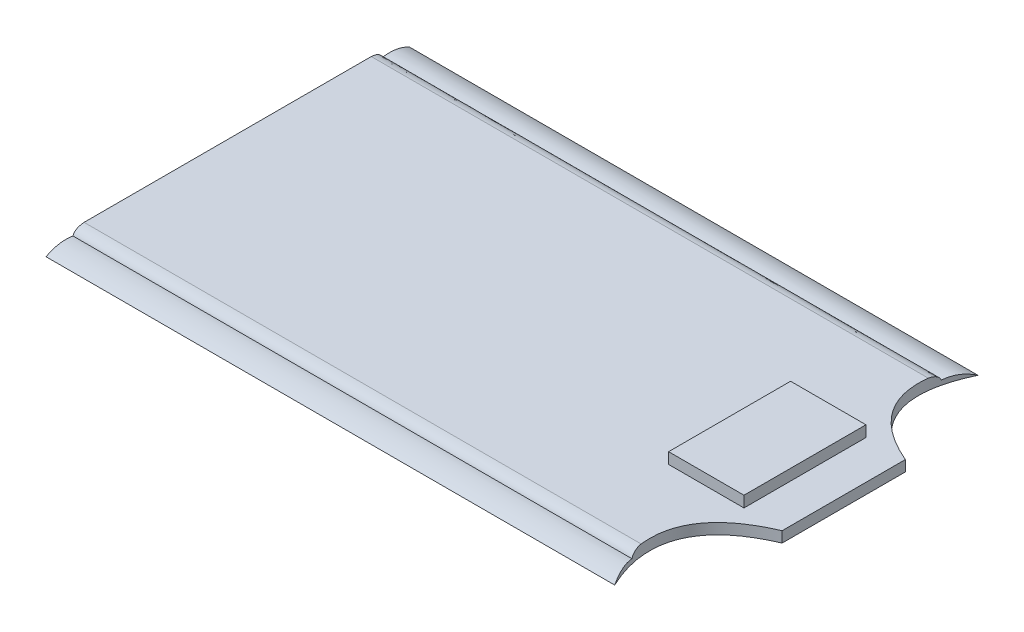
ISO-10303-21;
HEADER;
FILE_DESCRIPTION(('STEP AP214'),'2;1');
FILE_NAME('part.step','',(''),(''),'','','');
FILE_SCHEMA(('AUTOMOTIVE_DESIGN { 1 0 10303 214 1 1 1 1 }'));
ENDSEC;
DATA;
#1=APPLICATION_CONTEXT('core data for automotive mechanical design processes');
#2=APPLICATION_PROTOCOL_DEFINITION('international standard','automotive_design',2000,#1);
#3=PRODUCT_CONTEXT('',#1,'mechanical');
#4=PRODUCT('Part','Part','',(#3));
#5=PRODUCT_RELATED_PRODUCT_CATEGORY('part','',(#4));
#6=PRODUCT_DEFINITION_FORMATION('','',#4);
#7=PRODUCT_DEFINITION_CONTEXT('part definition',#1,'design');
#8=PRODUCT_DEFINITION('design','',#6,#7);
#9=PRODUCT_DEFINITION_SHAPE('','',#8);
#10=(LENGTH_UNIT() NAMED_UNIT(*) SI_UNIT(.MILLI.,.METRE.));
#11=(NAMED_UNIT(*) PLANE_ANGLE_UNIT() SI_UNIT($,.RADIAN.));
#12=(NAMED_UNIT(*) SI_UNIT($,.STERADIAN.) SOLID_ANGLE_UNIT());
#13=UNCERTAINTY_MEASURE_WITH_UNIT(LENGTH_MEASURE(1.E-05),#10,'distance_accuracy_value','');
#14=(GEOMETRIC_REPRESENTATION_CONTEXT(3) GLOBAL_UNCERTAINTY_ASSIGNED_CONTEXT((#13)) GLOBAL_UNIT_ASSIGNED_CONTEXT((#10,
#11,#12)) REPRESENTATION_CONTEXT('',''));
#15=CARTESIAN_POINT('',(0.,0.,0.));
#16=DIRECTION('',(0.,0.,1.));
#17=DIRECTION('',(1.,0.,0.));
#18=AXIS2_PLACEMENT_3D('',#15,#16,#17);
#19=CARTESIAN_POINT('',(1950.,17.0000000000001,-575.));
#20=DIRECTION('',(0.,-1.,0.));
#21=DIRECTION('',(0.,0.,-1.));
#22=AXIS2_PLACEMENT_3D('',#19,#20,#21);
#23=PLANE('',#22);
#24=DIRECTION('',(0.,0.,1.));
#25=VECTOR('',#24,1.);
#26=CARTESIAN_POINT('',(1950.,17.0000000000001,-575.));
#27=LINE('',#26,#25);
#28=CARTESIAN_POINT('',(1950.,16.9999999999999,-195.));
#29=VERTEX_POINT('',#28);
#30=CARTESIAN_POINT('',(1950.,16.9999999999999,195.));
#31=VERTEX_POINT('',#30);
#32=EDGE_CURVE('E229',#29,#31,#27,.T.);
#33=ORIENTED_EDGE('',*,*,#32,.F.);
#34=CARTESIAN_POINT('',(1950.,17.0000000000001,-195.));
#35=CARTESIAN_POINT('',(1676.16258696327,17.0000000000001,-312.417807061273));
#36=CARTESIAN_POINT('',(1800.,17.0000000000001,-575.));
#37=B_SPLINE_CURVE_WITH_KNOTS('',2,(#34,#35,#36),.UNSPECIFIED.,.F.,.F.,(3,3),(0.,1.),.UNSPECIFIED.);
#38=CARTESIAN_POINT('',(1763.12767606392,17.0000000000002,-454.506922220975));
#39=VERTEX_POINT('',#38);
#40=EDGE_CURVE('E187',#29,#39,#37,.T.);
#41=ORIENTED_EDGE('',*,*,#40,.T.);
#42=DIRECTION('',(1.,0.,0.));
#43=VECTOR('',#42,1.);
#44=CARTESIAN_POINT('',(0.,17.,-454.506922220975));
#45=LINE('',#44,#43);
#46=CARTESIAN_POINT('',(0.,17.,-454.506922220975));
#47=VERTEX_POINT('',#46);
#48=EDGE_CURVE('E211',#47,#39,#45,.T.);
#49=ORIENTED_EDGE('',*,*,#48,.F.);
#50=DIRECTION('',(0.,0.,1.));
#51=VECTOR('',#50,1.);
#52=CARTESIAN_POINT('',(0.,17.0000000000001,-575.));
#53=LINE('',#52,#51);
#54=CARTESIAN_POINT('',(0.,17.,454.506922220975));
#55=VERTEX_POINT('',#54);
#56=EDGE_CURVE('E230',#47,#55,#53,.T.);
#57=ORIENTED_EDGE('',*,*,#56,.T.);
#58=DIRECTION('',(1.,0.,0.));
#59=VECTOR('',#58,1.);
#60=CARTESIAN_POINT('',(0.,17.,454.506922220975));
#61=LINE('',#60,#59);
#62=CARTESIAN_POINT('',(1763.12767606392,17.,454.506922220975));
#63=VERTEX_POINT('',#62);
#64=EDGE_CURVE('E293',#55,#63,#61,.T.);
#65=ORIENTED_EDGE('',*,*,#64,.T.);
#66=CARTESIAN_POINT('',(1800.,16.9999999999999,575.));
#67=CARTESIAN_POINT('',(1676.16258696327,17.0000000000001,312.417807061273));
#68=CARTESIAN_POINT('',(1950.,17.0000000000001,195.));
#69=B_SPLINE_CURVE_WITH_KNOTS('',2,(#66,#67,#68),.UNSPECIFIED.,.F.,.F.,(3,3),(0.,1.),.UNSPECIFIED.);
#70=EDGE_CURVE('E263',#63,#31,#69,.T.);
#71=ORIENTED_EDGE('',*,*,#70,.T.);
#72=EDGE_LOOP('',(#33,#41,#49,#57,#65,#71));
#73=FACE_BOUND('',#72,.T.);
#74=DIRECTION('',(0.,0.,1.));
#75=VECTOR('',#74,1.);
#76=CARTESIAN_POINT('',(1588.72321213671,17.0000000000001,-193.063823766796));
#77=LINE('',#76,#75);
#78=CARTESIAN_POINT('',(1588.72321213671,17.0000000000001,-193.063823766796));
#79=VERTEX_POINT('',#78);
#80=CARTESIAN_POINT('',(1588.72321213671,17.,193.063823766796));
#81=VERTEX_POINT('',#80);
#82=EDGE_CURVE('E146',#79,#81,#77,.T.);
#83=ORIENTED_EDGE('',*,*,#82,.F.);
#84=DIRECTION('',(-1.,0.,0.));
#85=VECTOR('',#84,1.);
#86=CARTESIAN_POINT('',(1827.30614882413,17.0000000000001,-193.063823766796));
#87=LINE('',#86,#85);
#88=CARTESIAN_POINT('',(1827.30614882413,17.0000000000001,-193.063823766796));
#89=VERTEX_POINT('',#88);
#90=EDGE_CURVE('E143',#89,#79,#87,.T.);
#91=ORIENTED_EDGE('',*,*,#90,.F.);
#92=DIRECTION('',(0.,0.,-1.));
#93=VECTOR('',#92,1.);
#94=CARTESIAN_POINT('',(1827.30614882413,17.0000000000001,-193.063823766796));
#95=LINE('',#94,#93);
#96=CARTESIAN_POINT('',(1827.30614882413,17.,193.063823766796));
#97=VERTEX_POINT('',#96);
#98=EDGE_CURVE('E57',#97,#89,#95,.T.);
#99=ORIENTED_EDGE('',*,*,#98,.F.);
#100=DIRECTION('',(1.,0.,0.));
#101=VECTOR('',#100,1.);
#102=CARTESIAN_POINT('',(1827.30614882413,17.,193.063823766796));
#103=LINE('',#102,#101);
#104=EDGE_CURVE('E52',#81,#97,#103,.T.);
#105=ORIENTED_EDGE('',*,*,#104,.F.);
#106=EDGE_LOOP('',(#83,#91,#99,#105));
#107=FACE_BOUND('',#106,.T.);
#108=ADVANCED_FACE('F33',(#73,#107),#23,.F.);
#109=CARTESIAN_POINT('',(1950.,-16.9999999999999,-575.));
#110=DIRECTION('',(0.,1.,0.));
#111=DIRECTION('',(0.,0.,1.));
#112=AXIS2_PLACEMENT_3D('',#109,#110,#111);
#113=PLANE('',#112);
#114=DIRECTION('',(-1.,0.,0.));
#115=VECTOR('',#114,1.);
#116=CARTESIAN_POINT('',(1950.,-16.9999999999999,-575.));
#117=LINE('',#116,#115);
#118=CARTESIAN_POINT('',(1800.,-16.9999999999999,-575.));
#119=VERTEX_POINT('',#118);
#120=CARTESIAN_POINT('',(0.,-17.,-575.));
#121=VERTEX_POINT('',#120);
#122=EDGE_CURVE('E232',#119,#121,#117,.T.);
#123=ORIENTED_EDGE('',*,*,#122,.F.);
#124=CARTESIAN_POINT('',(1950.,-17.,-195.));
#125=CARTESIAN_POINT('',(1676.16258696327,-16.9999999999999,-312.417807061273));
#126=CARTESIAN_POINT('',(1800.,-16.9999999999999,-575.));
#127=B_SPLINE_CURVE_WITH_KNOTS('',2,(#124,#125,#126),.UNSPECIFIED.,.F.,.F.,(3,3),(0.,1.),.UNSPECIFIED.);
#128=CARTESIAN_POINT('',(1950.,-17.,-195.));
#129=VERTEX_POINT('',#128);
#130=EDGE_CURVE('E147',#129,#119,#127,.T.);
#131=ORIENTED_EDGE('',*,*,#130,.F.);
#132=DIRECTION('',(0.,0.,-1.));
#133=VECTOR('',#132,1.);
#134=CARTESIAN_POINT('',(1950.,-16.9999999999999,-575.));
#135=LINE('',#134,#133);
#136=CARTESIAN_POINT('',(1950.,-17.,195.));
#137=VERTEX_POINT('',#136);
#138=EDGE_CURVE('E226',#137,#129,#135,.T.);
#139=ORIENTED_EDGE('',*,*,#138,.F.);
#140=CARTESIAN_POINT('',(1800.,-17.,575.));
#141=CARTESIAN_POINT('',(1676.16258696327,-17.,312.417807061273));
#142=CARTESIAN_POINT('',(1950.,-17.,195.));
#143=B_SPLINE_CURVE_WITH_KNOTS('',2,(#140,#141,#142),.UNSPECIFIED.,.F.,.F.,(3,3),(0.,1.),.UNSPECIFIED.);
#144=CARTESIAN_POINT('',(1800.,-17.,575.));
#145=VERTEX_POINT('',#144);
#146=EDGE_CURVE('E246',#145,#137,#143,.T.);
#147=ORIENTED_EDGE('',*,*,#146,.F.);
#148=DIRECTION('',(-1.,0.,0.));
#149=VECTOR('',#148,1.);
#150=CARTESIAN_POINT('',(1950.,-17.,575.));
#151=LINE('',#150,#149);
#152=CARTESIAN_POINT('',(0.,-17.,575.));
#153=VERTEX_POINT('',#152);
#154=EDGE_CURVE('E241',#145,#153,#151,.T.);
#155=ORIENTED_EDGE('',*,*,#154,.T.);
#156=DIRECTION('',(0.,0.,-1.));
#157=VECTOR('',#156,1.);
#158=CARTESIAN_POINT('',(0.,-16.9999999999999,-575.));
#159=LINE('',#158,#157);
#160=EDGE_CURVE('E223',#153,#121,#159,.T.);
#161=ORIENTED_EDGE('',*,*,#160,.T.);
#162=EDGE_LOOP('',(#123,#131,#139,#147,#155,#161));
#163=FACE_BOUND('',#162,.T.);
#164=ADVANCED_FACE('F35',(#163),#113,.F.);
#165=CARTESIAN_POINT('',(1950.,0.,0.));
#166=DIRECTION('',(1.,0.,0.));
#167=DIRECTION('',(0.,0.,-1.));
#168=AXIS2_PLACEMENT_3D('',#165,#166,#167);
#169=PLANE('',#168);
#170=DIRECTION('',(0.,-1.,0.));
#171=VECTOR('',#170,1.);
#172=CARTESIAN_POINT('',(1950.,1933.,-195.));
#173=LINE('',#172,#171);
#174=EDGE_CURVE('E149',#29,#129,#173,.T.);
#175=ORIENTED_EDGE('',*,*,#174,.F.);
#176=ORIENTED_EDGE('',*,*,#32,.T.);
#177=DIRECTION('',(0.,-1.,0.));
#178=VECTOR('',#177,1.);
#179=CARTESIAN_POINT('',(1950.,1933.,195.));
#180=LINE('',#179,#178);
#181=EDGE_CURVE('E257',#31,#137,#180,.T.);
#182=ORIENTED_EDGE('',*,*,#181,.T.);
#183=ORIENTED_EDGE('',*,*,#138,.T.);
#184=EDGE_LOOP('',(#175,#176,#182,#183));
#185=FACE_BOUND('',#184,.T.);
#186=ADVANCED_FACE('F255',(#185),#169,.T.);
#187=CARTESIAN_POINT('',(0.,0.,0.));
#188=DIRECTION('',(1.,0.,0.));
#189=DIRECTION('',(0.,0.,-1.));
#190=AXIS2_PLACEMENT_3D('',#187,#188,#189);
#191=PLANE('',#190);
#192=CARTESIAN_POINT('',(0.,-17.,575.));
#193=CARTESIAN_POINT('',(0.,4.52243182514028,534.776362321859));
#194=CARTESIAN_POINT('',(0.,-2.77702803800314,489.682610702436));
#195=B_SPLINE_CURVE_WITH_KNOTS('',2,(#192,#193,#194),.UNSPECIFIED.,.F.,.F.,(3,3),(0.,1.),.UNSPECIFIED.);
#196=CARTESIAN_POINT('',(0.,-2.77702803800314,489.682610702436));
#197=VERTEX_POINT('',#196);
#198=EDGE_CURVE('E284',#153,#197,#195,.T.);
#199=ORIENTED_EDGE('',*,*,#198,.T.);
#200=CARTESIAN_POINT('',(0.,-2.77702803800314,489.682610702436));
#201=CARTESIAN_POINT('',(0.,14.5776105210799,483.149171874636));
#202=CARTESIAN_POINT('',(0.,17.0000000000001,454.506922220975));
#203=B_SPLINE_CURVE_WITH_KNOTS('',2,(#200,#201,#202),.UNSPECIFIED.,.F.,.F.,(3,3),(0.,
0.737774991164167),.UNSPECIFIED.);
#204=EDGE_CURVE('E275',#197,#55,#203,.T.);
#205=ORIENTED_EDGE('',*,*,#204,.T.);
#206=ORIENTED_EDGE('',*,*,#56,.F.);
#207=CARTESIAN_POINT('',(0.,17.0000000000001,-454.506922220975));
#208=CARTESIAN_POINT('',(0.,14.5776105210799,-483.149171874636));
#209=CARTESIAN_POINT('',(0.,-2.77702803800314,-489.682610702436));
#210=B_SPLINE_CURVE_WITH_KNOTS('',2,(#207,#208,#209),.UNSPECIFIED.,.F.,.F.,(3,3),(0.,
0.737774991164167),.UNSPECIFIED.);
#211=CARTESIAN_POINT('',(0.,-2.77702803800314,-489.682610702436));
#212=VERTEX_POINT('',#211);
#213=EDGE_CURVE('E212',#47,#212,#210,.T.);
#214=ORIENTED_EDGE('',*,*,#213,.T.);
#215=CARTESIAN_POINT('',(0.,-2.77702803800314,-489.682610702436));
#216=CARTESIAN_POINT('',(0.,4.52243182514017,-534.77636232186));
#217=CARTESIAN_POINT('',(0.,-17.,-575.));
#218=B_SPLINE_CURVE_WITH_KNOTS('',2,(#215,#216,#217),.UNSPECIFIED.,.F.,.F.,(3,3),(0.,1.),.UNSPECIFIED.);
#219=EDGE_CURVE('E205',#212,#121,#218,.T.);
#220=ORIENTED_EDGE('',*,*,#219,.T.);
#221=ORIENTED_EDGE('',*,*,#160,.F.);
#222=EDGE_LOOP('',(#199,#205,#206,#214,#220,#221));
#223=FACE_BOUND('',#222,.T.);
#224=ADVANCED_FACE('F197',(#223),#191,.F.);
#225=DIRECTION('',(1.,0.,0.));
#226=VECTOR('',#225,1.);
#227=SURFACE_OF_LINEAR_EXTRUSION('',#218,#226);
#228=DIRECTION('',(1.,0.,0.));
#229=VECTOR('',#228,1.);
#230=CARTESIAN_POINT('',(0.,-2.77702803800314,-489.682610702436));
#231=LINE('',#230,#229);
#232=CARTESIAN_POINT('',(1769.33269647087,-2.77702803800314,-489.682610702436));
#233=VERTEX_POINT('',#232);
#234=EDGE_CURVE('E217',#212,#233,#231,.T.);
#235=ORIENTED_EDGE('',*,*,#234,.T.);
#236=CARTESIAN_POINT('',(1769.33269647087,-2.7770280380031,-489.682610702435));
#237=CARTESIAN_POINT('',(1769.62143128453,-2.57864186393632,-490.908097520049));
#238=CARTESIAN_POINT('',(1769.91759446953,-2.39568670520538,-492.134342439013));
#239=CARTESIAN_POINT('',(1770.52440514305,-2.06119518337844,-494.587593247005));
#240=CARTESIAN_POINT('',(1770.83505330233,-1.90966027702215,-495.81459916867));
#241=CARTESIAN_POINT('',(1771.47043820425,-1.63858300320037,-498.268516730505));
#242=CARTESIAN_POINT('',(1771.79517510464,-1.51904099404653,-499.495428369465));
#243=CARTESIAN_POINT('',(1772.45830697005,-1.31242007615133,-501.948337045258));
#244=CARTESIAN_POINT('',(1772.79670237476,-1.22534221341652,-503.17433405135));
#245=CARTESIAN_POINT('',(1773.48666584474,-1.08405286744097,-505.624501955823));
#246=CARTESIAN_POINT('',(1773.83823371936,-1.02984090870083,-506.848672880367));
#247=CARTESIAN_POINT('',(1774.55402719084,-0.954588484870045,-509.294303257139));
#248=CARTESIAN_POINT('',(1774.91825270429,-0.933547801214306,-510.51576272718));
#249=CARTESIAN_POINT('',(1775.8416014331,-0.922724039405273,-513.557143353813));
#250=CARTESIAN_POINT('',(1776.40819871263,-0.953492038871983,-515.374914899237));
#251=CARTESIAN_POINT('',(1777.56650851756,-1.08989310974318,-518.999575737075));
#252=CARTESIAN_POINT('',(1778.15822113504,-1.19552645567229,-520.806464989561));
#253=CARTESIAN_POINT('',(1779.36462679441,-1.48151155259613,-524.406269870882));
#254=CARTESIAN_POINT('',(1779.97931591435,-1.66185060428158,-526.199187821965));
#255=CARTESIAN_POINT('',(1781.2296390595,-2.09666713925566,-529.768643187551));
#256=CARTESIAN_POINT('',(1781.86527314221,-2.35114482605385,-531.545180557075));
#257=CARTESIAN_POINT('',(1783.17421246845,-2.94174916473282,-535.131117771293));
#258=CARTESIAN_POINT('',(1783.84807578814,-3.28004914155394,-536.93995590533));
#259=CARTESIAN_POINT('',(1785.21331647729,-4.03256591535319,-540.535084668996));
#260=CARTESIAN_POINT('',(1785.90469399828,-4.44678336939233,-542.321375103333));
#261=CARTESIAN_POINT('',(1787.30287036986,-5.34934291543793,-545.869814283431));
#262=CARTESIAN_POINT('',(1788.00967499016,-5.83771316184592,-547.631953581223));
#263=CARTESIAN_POINT('',(1789.43617266656,-6.88617267565028,-551.129466021752));
#264=CARTESIAN_POINT('',(1790.15586561855,-7.44626136403856,-552.864839380453));
#265=CARTESIAN_POINT('',(1791.37656911693,-8.44744235431076,-555.762660559609));
#266=CARTESIAN_POINT('',(1791.87474547186,-8.87013750239134,-556.932705311106));
#267=CARTESIAN_POINT('',(1792.87544355294,-9.74696807127915,-559.259110872343));
#268=CARTESIAN_POINT('',(1793.37796534108,-10.2011039412834,-560.415471486299));
#269=CARTESIAN_POINT('',(1794.38671937254,-11.1399077694295,-562.71414220041));
#270=CARTESIAN_POINT('',(1794.89295175915,-11.6245769121313,-563.856451753386));
#271=CARTESIAN_POINT('',(1795.90802054801,-12.6230157828129,-566.125594080354));
#272=CARTESIAN_POINT('',(1796.41685402168,-13.1367574456168,-567.252440518463));
#273=CARTESIAN_POINT('',(1797.43700414508,-14.1927791781583,-569.491464009355));
#274=CARTESIAN_POINT('',(1797.94832069007,-14.7350580535392,-570.60364167363));
#275=CARTESIAN_POINT('',(1798.97285176052,-15.8471250110628,-572.813039689211));
#276=CARTESIAN_POINT('',(1799.48606600077,-16.4169091030448,-573.910262180613));
#277=CARTESIAN_POINT('',(1800.,-17.,-575.));
#278=B_SPLINE_CURVE_WITH_KNOTS('',3,(#236,#237,#238,#239,#240,#241,#242,#243,#244,#245,#246,
#247,#248,#249,#250,#251,#252,#253,#254,#255,#256,#257,#258,#259,#260,#261,#262,#263,#264,#265,
#266,#267,#268,#269,#270,#271,#272,#273,#274,#275,#276,#277),.UNSPECIFIED.,.F.,.F.,(4,2,2,2,2,2,
2,2,2,2,2,2,2,2,2,2,2,2,2,2,4),(0.,3.82362602607938,7.64742928762185,11.4712753729145,
15.2952446532662,19.119158607633,22.9430473661756,28.6541100369392,34.3651936497742,
40.0753068270332,45.7854356786244,51.6628265418481,57.540268275924,63.4199471686833,
69.2995785957282,73.3194513310497,77.339381510591,81.3594677423269,85.375737274886,
89.3918388495769,93.4073595521354),.UNSPECIFIED.);
#279=EDGE_CURVE('E242',#233,#119,#278,.T.);
#280=ORIENTED_EDGE('',*,*,#279,.T.);
#281=ORIENTED_EDGE('',*,*,#122,.T.);
#282=ORIENTED_EDGE('',*,*,#219,.F.);
#283=EDGE_LOOP('',(#235,#280,#281,#282));
#284=FACE_BOUND('',#283,.T.);
#285=ADVANCED_FACE('F191',(#284),#227,.F.);
#286=DIRECTION('',(1.,0.,0.));
#287=VECTOR('',#286,1.);
#288=SURFACE_OF_LINEAR_EXTRUSION('',#210,#287);
#289=ORIENTED_EDGE('',*,*,#48,.T.);
#290=CARTESIAN_POINT('',(1763.12767606392,17.0000000000002,-454.506922220975));
#291=CARTESIAN_POINT('',(1763.18041362047,16.9609812168829,-454.968239093242));
#292=CARTESIAN_POINT('',(1763.2342870947,16.9187350992673,-455.429148295483));
#293=CARTESIAN_POINT('',(1763.34426467068,16.8274376169704,-456.350041402965));
#294=CARTESIAN_POINT('',(1763.40036885106,16.7783860122437,-456.810025274987));
#295=CARTESIAN_POINT('',(1763.57281359866,16.6197160388475,-458.195232465354));
#296=CARTESIAN_POINT('',(1763.69249819089,16.4991536705336,-459.118822054921));
#297=CARTESIAN_POINT('',(1763.94080972235,16.225190751961,-460.964053424299));
#298=CARTESIAN_POINT('',(1764.0694727916,16.0716516650972,-461.885669887515));
#299=CARTESIAN_POINT('',(1764.33490939981,15.7280170432505,-463.722456130505));
#300=CARTESIAN_POINT('',(1764.47169522343,15.5378651090925,-464.637613676509));
#301=CARTESIAN_POINT('',(1764.75676012217,15.1103737501924,-466.485434241066));
#302=CARTESIAN_POINT('',(1764.90526316692,14.8717643566275,-467.417771574103));
#303=CARTESIAN_POINT('',(1765.20855028735,14.3463890200158,-469.26596451343));
#304=CARTESIAN_POINT('',(1765.3633222845,14.0597126269955,-470.18184732527));
#305=CARTESIAN_POINT('',(1765.67764411913,13.4326281399623,-471.992006229672));
#306=CARTESIAN_POINT('',(1765.83718271247,13.0923394800577,-472.886325371988));
#307=CARTESIAN_POINT('',(1766.15935214595,12.3515347274664,-474.648162226807));
#308=CARTESIAN_POINT('',(1766.32197910243,11.9510903996298,-475.515710409814));
#309=CARTESIAN_POINT('',(1766.57335469896,11.2820965125037,-476.827024656428));
#310=CARTESIAN_POINT('',(1766.66183485974,11.0371112572556,-477.282944699613));
#311=CARTESIAN_POINT('',(1766.83858096519,10.5264682377286,-478.183264395894));
#312=CARTESIAN_POINT('',(1766.92684686893,10.2608068029561,-478.627661984737));
#313=CARTESIAN_POINT('',(1767.10262497638,9.70797987253085,-479.503105551622));
#314=CARTESIAN_POINT('',(1767.19013711861,9.42081264116486,-479.934150448001));
#315=CARTESIAN_POINT('',(1767.3632700776,8.82616140667329,-480.778273495189));
#316=CARTESIAN_POINT('',(1767.44889930514,8.51881585398989,-481.191447233599));
#317=CARTESIAN_POINT('',(1767.61819599125,7.88176842349013,-482.00062651588));
#318=CARTESIAN_POINT('',(1767.70186349252,7.55206703290903,-482.396632433606));
#319=CARTESIAN_POINT('',(1767.86656467416,6.87016090481937,-483.169345872228));
#320=CARTESIAN_POINT('',(1767.94759849074,6.51795733403215,-483.546054391858));
#321=CARTESIAN_POINT('',(1768.10741814677,5.78632318695951,-484.283011073601));
#322=CARTESIAN_POINT('',(1768.1861588787,5.40658926957444,-484.642968417424));
#323=CARTESIAN_POINT('',(1768.33952412911,4.62478838767031,-485.338813495939));
#324=CARTESIAN_POINT('',(1768.41414821374,4.22271907822416,-485.674698694857));
#325=CARTESIAN_POINT('',(1768.55860446187,3.3973171360615,-486.320490100646));
#326=CARTESIAN_POINT('',(1768.62843604282,2.97398192916624,-486.630393150272));
#327=CARTESIAN_POINT('',(1768.7626439678,2.10793317068226,-487.222372142685));
#328=CARTESIAN_POINT('',(1768.82702446711,1.66523477696917,-487.504469308877));
#329=CARTESIAN_POINT('',(1768.9498865768,0.762093511220733,-488.039927132356));
#330=CARTESIAN_POINT('',(1769.00836891513,0.30165283864854,-488.293291336334));
#331=CARTESIAN_POINT('',(1769.11903735048,-0.634569005944358,-488.770499921633));
#332=CARTESIAN_POINT('',(1769.1712285202,-1.11033742123565,-488.994368099944));
#333=CARTESIAN_POINT('',(1769.24001092221,-1.78816334242765,-489.288218339516));
#334=CARTESIAN_POINT('',(1769.25931100675,-1.98468760699384,-489.370524128511));
#335=CARTESIAN_POINT('',(1769.29681660627,-2.37950007554369,-489.530212806674));
#336=CARTESIAN_POINT('',(1769.31502364827,-2.57778535245703,-489.607602572851));
#337=CARTESIAN_POINT('',(1769.33269647087,-2.77702803800314,-489.682610702436));
#338=B_SPLINE_CURVE_WITH_KNOTS('',3,(#290,#291,#292,#293,#294,#295,#296,#297,#298,#299,#300,
#301,#302,#303,#304,#305,#306,#307,#308,#309,#310,#311,#312,#313,#314,#315,#316,#317,#318,#319,
#320,#321,#322,#323,#324,#325,#326,#327,#328,#329,#330,#331,#332,#333,#334,#335,#336,#337),
.UNSPECIFIED.,.F.,.F.,(4,2,2,2,2,2,2,2,2,2,2,2,2,2,2,2,2,2,2,2,2,2,2,4),(0.,1.39784913050462,
2.79574757895725,5.61240816762141,8.44114157138116,11.2742677878505,14.1944131982707,
17.1091775528721,20.0175380732424,22.9224561176616,24.4972518830536,26.0723278510942,
27.6475310793712,29.2128726094872,30.7781800346604,32.3434063655675,33.9297602153581,
35.5162809276932,37.1029941489708,38.6884867453725,40.2737834208397,41.8577931650101,
42.499548337434,43.1403850373046),.UNSPECIFIED.);
#339=EDGE_CURVE('E11',#39,#233,#338,.T.);
#340=ORIENTED_EDGE('',*,*,#339,.T.);
#341=ORIENTED_EDGE('',*,*,#234,.F.);
#342=ORIENTED_EDGE('',*,*,#213,.F.);
#343=EDGE_LOOP('',(#289,#340,#341,#342));
#344=FACE_BOUND('',#343,.T.);
#345=ADVANCED_FACE('F196',(#344),#288,.F.);
#346=DIRECTION('',(1.,0.,0.));
#347=VECTOR('',#346,1.);
#348=SURFACE_OF_LINEAR_EXTRUSION('',#203,#347);
#349=DIRECTION('',(1.,0.,0.));
#350=VECTOR('',#349,1.);
#351=CARTESIAN_POINT('',(0.,-2.77702803800314,489.682610702436));
#352=LINE('',#351,#350);
#353=CARTESIAN_POINT('',(1769.33269647087,-2.77702803800314,489.682610702436));
#354=VERTEX_POINT('',#353);
#355=EDGE_CURVE('E294',#197,#354,#352,.T.);
#356=ORIENTED_EDGE('',*,*,#355,.T.);
#357=CARTESIAN_POINT('',(1769.33269647087,-2.7770280380031,489.682610702436));
#358=CARTESIAN_POINT('',(1769.30144885279,-2.42467219646052,489.549982897874));
#359=CARTESIAN_POINT('',(1769.26851558883,-2.07527231915985,489.409851335264));
#360=CARTESIAN_POINT('',(1769.19934029699,-1.3832186864371,489.114563157889));
#361=CARTESIAN_POINT('',(1769.16309828278,-1.04056490316635,488.959406605166));
#362=CARTESIAN_POINT('',(1769.08737079607,-0.362861905695459,488.634062863532));
#363=CARTESIAN_POINT('',(1769.04788558392,-0.0278120838058479,488.463876881091));
#364=CARTESIAN_POINT('',(1768.96578045571,0.633885418195237,488.108619995002));
#365=CARTESIAN_POINT('',(1768.9231607165,0.96053357097977,487.923549931153));
#366=CARTESIAN_POINT('',(1768.83537503096,1.6014165128525,487.5407406884));
#367=CARTESIAN_POINT('',(1768.79023932482,1.91574365463988,487.343149193438));
#368=CARTESIAN_POINT('',(1768.69720808484,2.53475145105986,486.934039439477));
#369=CARTESIAN_POINT('',(1768.64931271111,2.8394326637533,486.722521988347));
#370=CARTESIAN_POINT('',(1768.55096020662,3.43857176793845,486.286056509489));
#371=CARTESIAN_POINT('',(1768.50050317953,3.73303007235746,486.061109025232));
#372=CARTESIAN_POINT('',(1768.39725317693,4.311221176433,485.598398679591));
#373=CARTESIAN_POINT('',(1768.34446037804,4.59495478414168,485.360636786997));
#374=CARTESIAN_POINT('',(1768.21881056193,5.24414353232192,484.791604654649));
#375=CARTESIAN_POINT('',(1768.14513349294,5.60529793177454,484.45559220931));
#376=CARTESIAN_POINT('',(1767.99462998964,6.30732793914518,483.763664585257));
#377=CARTESIAN_POINT('',(1767.91780326409,6.64820166453178,483.407747564853));
#378=CARTESIAN_POINT('',(1767.76160982467,7.30939869936783,482.677883557692));
#379=CARTESIAN_POINT('',(1767.68224318357,7.62972259667995,482.303937087235));
#380=CARTESIAN_POINT('',(1767.52141723503,8.25043814823219,481.539191784823));
#381=CARTESIAN_POINT('',(1767.43995448369,8.55079365209717,481.148364393964));
#382=CARTESIAN_POINT('',(1767.27563462994,9.13128226942288,480.35228518316));
#383=CARTESIAN_POINT('',(1767.1927775495,9.41141570103404,479.947033590298));
#384=CARTESIAN_POINT('',(1767.02618522649,9.95201728052403,479.123789218818));
#385=CARTESIAN_POINT('',(1766.94244990881,10.2124837305435,478.705795344514));
#386=CARTESIAN_POINT('',(1766.72757499964,10.8549746691401,477.621443374643));
#387=CARTESIAN_POINT('',(1766.59614281017,11.223409928426,476.94705765519));
#388=CARTESIAN_POINT('',(1766.33382303888,11.9172836541441,475.576146906041));
#389=CARTESIAN_POINT('',(1766.20293577433,12.2426997557586,474.879610592289));
#390=CARTESIAN_POINT('',(1765.94301027944,12.853784169326,473.46887395854));
#391=CARTESIAN_POINT('',(1765.81397245069,13.1394439623093,472.754669891197));
#392=CARTESIAN_POINT('',(1765.55822697551,13.6755064170361,471.309015359263));
#393=CARTESIAN_POINT('',(1765.43153261495,13.925742613856,470.577501172163));
#394=CARTESIAN_POINT('',(1765.18195248271,14.3925950643673,469.103479699746));
#395=CARTESIAN_POINT('',(1765.05906562737,14.6092209556785,468.360975632876));
#396=CARTESIAN_POINT('',(1764.81773952904,15.0119338631952,466.867135777083));
#397=CARTESIAN_POINT('',(1764.69929984849,15.198023890079,466.115800866673));
#398=CARTESIAN_POINT('',(1764.49160273999,15.5064648629165,464.763701455122));
#399=CARTESIAN_POINT('',(1764.40141558556,15.6340115759671,464.16425301247));
#400=CARTESIAN_POINT('',(1764.22437132775,15.8729412453491,462.961700156244));
#401=CARTESIAN_POINT('',(1764.1375140099,15.9843252440017,462.358595981041));
#402=CARTESIAN_POINT('',(1763.96730417912,16.1920765185156,461.149289679392));
#403=CARTESIAN_POINT('',(1763.8839518671,16.2884429343907,460.543087377582));
#404=CARTESIAN_POINT('',(1763.72189416392,16.4661097532634,459.33544611626));
#405=CARTESIAN_POINT('',(1763.64314494018,16.5475774201104,458.73403755765));
#406=CARTESIAN_POINT('',(1763.48936225333,16.6977649974076,457.529215849193));
#407=CARTESIAN_POINT('',(1763.41432848952,16.7664859407539,456.925802865805));
#408=CARTESIAN_POINT('',(1763.2681017316,16.8919854893177,455.71745905774));
#409=CARTESIAN_POINT('',(1763.19690756677,16.9487677502351,455.112528755258));
#410=CARTESIAN_POINT('',(1763.12767606392,17.0000000000001,454.506922220975));
#411=B_SPLINE_CURVE_WITH_KNOTS('',3,(#357,#358,#359,#360,#361,#362,#363,#364,#365,#366,#367,
#368,#369,#370,#371,#372,#373,#374,#375,#376,#377,#378,#379,#380,#381,#382,#383,#384,#385,#386,
#387,#388,#389,#390,#391,#392,#393,#394,#395,#396,#397,#398,#399,#400,#401,#402,#403,#404,#405,
#406,#407,#408,#409,#410),.UNSPECIFIED.,.F.,.F.,(4,2,2,2,2,2,2,2,2,2,2,2,2,2,2,2,2,2,2,2,2,2,2,
2,2,2,4),(0.,1.13328914946522,2.26657361959878,3.39976719926917,4.53289688605391,
5.65452350997894,6.77608512367947,7.89760138203869,9.01903297064259,10.5144346882613,
12.0099749990389,13.5054725082565,15.0036075885472,16.5017190937935,17.9999597841537,
20.3370343107578,22.6753190981781,25.014104163631,27.3635388005615,29.7122984964972,
32.0608264775386,33.9189979170202,35.777049471112,37.6352073879871,39.4710166285727,
41.3066770442981,43.1417745479499),.UNSPECIFIED.);
#412=EDGE_CURVE('E260',#354,#63,#411,.T.);
#413=ORIENTED_EDGE('',*,*,#412,.T.);
#414=ORIENTED_EDGE('',*,*,#64,.F.);
#415=ORIENTED_EDGE('',*,*,#204,.F.);
#416=EDGE_LOOP('',(#356,#413,#414,#415));
#417=FACE_BOUND('',#416,.T.);
#418=ADVANCED_FACE('F199',(#417),#348,.F.);
#419=DIRECTION('',(1.,0.,0.));
#420=VECTOR('',#419,1.);
#421=SURFACE_OF_LINEAR_EXTRUSION('',#195,#420);
#422=ORIENTED_EDGE('',*,*,#154,.F.);
#423=CARTESIAN_POINT('',(1800.,-17.0000000000001,575.));
#424=CARTESIAN_POINT('',(1799.25900672093,-16.1592722190595,573.428801455609));
#425=CARTESIAN_POINT('',(1798.51948206372,-15.3462129002025,571.841995957695));
#426=CARTESIAN_POINT('',(1797.04419031022,-13.7774353680343,568.635987967326));
#427=CARTESIAN_POINT('',(1796.30842840039,-13.0217829460868,567.016750913044));
#428=CARTESIAN_POINT('',(1794.84273024057,-11.5713065872448,563.747281673053));
#429=CARTESIAN_POINT('',(1794.11279769324,-10.8765188889278,562.097031723009));
#430=CARTESIAN_POINT('',(1792.66090533711,-9.55097148524485,558.767113975148));
#431=CARTESIAN_POINT('',(1791.93894706203,-8.92022391214264,557.08744067355));
#432=CARTESIAN_POINT('',(1790.50646050899,-7.72672913922802,553.703396812758));
#433=CARTESIAN_POINT('',(1789.79591328192,-7.16385623456499,551.999078665214));
#434=CARTESIAN_POINT('',(1788.38715162523,-6.10739293139873,548.564702675729));
#435=CARTESIAN_POINT('',(1787.68893349107,-5.61378140117698,546.834652863494));
#436=CARTESIAN_POINT('',(1786.30703479851,-4.69805423985965,543.350769713992));
#437=CARTESIAN_POINT('',(1785.62334897276,-4.27591230384379,541.596945384939));
#438=CARTESIAN_POINT('',(1784.27268617701,-3.50496042333429,538.067507938877));
#439=CARTESIAN_POINT('',(1783.60570379191,-3.15612643470067,536.291902168786));
#440=CARTESIAN_POINT('',(1782.50850009005,-2.63643688651091,533.312683566282));
#441=CARTESIAN_POINT('',(1782.07307787878,-2.44491282949768,532.114548585453));
#442=CARTESIAN_POINT('',(1781.21131866181,-2.0956293744168,529.710197868786));
#443=CARTESIAN_POINT('',(1780.78498098245,-1.93786746480527,528.503982740915));
#444=CARTESIAN_POINT('',(1779.94204585413,-1.65637654699409,526.084232706546));
#445=CARTESIAN_POINT('',(1779.52544819556,-1.53264680576398,524.870697958284));
#446=CARTESIAN_POINT('',(1778.70297319797,-1.31948418644421,522.438094856049));
#447=CARTESIAN_POINT('',(1778.29708749845,-1.23002377750369,521.219031743481));
#448=CARTESIAN_POINT('',(1777.49632397662,-1.08534588937624,518.775243214212));
#449=CARTESIAN_POINT('',(1777.10144637449,-1.03012909465183,517.550517684822));
#450=CARTESIAN_POINT('',(1776.32332923509,-0.953931387717937,515.096311976909));
#451=CARTESIAN_POINT('',(1775.94008972113,-0.932950544111967,513.866831788862));
#452=CARTESIAN_POINT('',(1775.17467160993,-0.925001927093212,511.367528202083));
#453=CARTESIAN_POINT('',(1774.79286085261,-0.9390602990185,510.097588764619));
#454=CARTESIAN_POINT('',(1774.04282596264,-1.00313468502465,507.554598822297));
#455=CARTESIAN_POINT('',(1773.67460195118,-1.05315101976362,506.281548289797));
#456=CARTESIAN_POINT('',(1772.95231823823,-1.18881295183245,503.733307947473));
#457=CARTESIAN_POINT('',(1772.59825877462,-1.27445914727776,502.458118102095));
#458=CARTESIAN_POINT('',(1771.90438333482,-1.48108715176797,499.904878134911));
#459=CARTESIAN_POINT('',(1771.56458712688,-1.60211626357604,498.626826471774));
#460=CARTESIAN_POINT('',(1770.90024678583,-1.87894027828695,496.070546614639));
#461=CARTESIAN_POINT('',(1770.57570246106,-2.03473474417011,494.792318423062));
#462=CARTESIAN_POINT('',(1769.94231729745,-2.38044744079115,492.236655821638));
#463=CARTESIAN_POINT('',(1769.63347564606,-2.57036390351659,490.959221374104));
#464=CARTESIAN_POINT('',(1769.33269647087,-2.77702803800314,489.682610702436));
#465=B_SPLINE_CURVE_WITH_KNOTS('',3,(#423,#424,#425,#426,#427,#428,#429,#430,#431,#432,#433,
#434,#435,#436,#437,#438,#439,#440,#441,#442,#443,#444,#445,#446,#447,#448,#449,#450,#451,#452,
#453,#454,#455,#456,#457,#458,#459,#460,#461,#462,#463,#464),.UNSPECIFIED.,.F.,.F.,(4,2,2,2,2,2,
2,2,2,2,2,2,2,2,2,2,2,2,2,2,4),(0.,5.78960551305339,11.5857491438411,17.3853206439283,
23.1859888182195,28.9757434753977,34.7637278133549,40.5495771870632,46.3335258985568,
50.2003995839078,54.0669855150095,57.9334881558767,61.7968780289791,65.6603451211618,
69.5238199551217,73.5017605858271,77.479736690586,81.4577795759872,85.4411651440681,
89.4245006416144,93.4076298043192),.UNSPECIFIED.);
#466=EDGE_CURVE('E44',#145,#354,#465,.T.);
#467=ORIENTED_EDGE('',*,*,#466,.T.);
#468=ORIENTED_EDGE('',*,*,#355,.F.);
#469=ORIENTED_EDGE('',*,*,#198,.F.);
#470=EDGE_LOOP('',(#422,#467,#468,#469));
#471=FACE_BOUND('',#470,.T.);
#472=ADVANCED_FACE('F298',(#471),#421,.F.);
#473=CARTESIAN_POINT('',(1800.,1933.,575.));
#474=CARTESIAN_POINT('',(1676.16258696327,1933.,312.417807061273));
#475=CARTESIAN_POINT('',(1950.,1933.,195.));
#476=B_SPLINE_CURVE_WITH_KNOTS('',2,(#473,#474,#475),.UNSPECIFIED.,.F.,.F.,(3,3),(0.,1.),.UNSPECIFIED.);
#477=DIRECTION('',(0.,-1.,0.));
#478=VECTOR('',#477,1.);
#479=SURFACE_OF_LINEAR_EXTRUSION('',#476,#478);
#480=ORIENTED_EDGE('',*,*,#412,.F.);
#481=ORIENTED_EDGE('',*,*,#466,.F.);
#482=ORIENTED_EDGE('',*,*,#146,.T.);
#483=ORIENTED_EDGE('',*,*,#181,.F.);
#484=ORIENTED_EDGE('',*,*,#70,.F.);
#485=EDGE_LOOP('',(#480,#481,#482,#483,#484));
#486=FACE_BOUND('',#485,.T.);
#487=ADVANCED_FACE('F168',(#486),#479,.F.);
#488=CARTESIAN_POINT('',(1950.,1933.,-195.));
#489=CARTESIAN_POINT('',(1676.16258696327,1933.,-312.417807061273));
#490=CARTESIAN_POINT('',(1800.,1933.,-575.));
#491=B_SPLINE_CURVE_WITH_KNOTS('',2,(#488,#489,#490),.UNSPECIFIED.,.F.,.F.,(3,3),(0.,1.),.UNSPECIFIED.);
#492=DIRECTION('',(0.,-1.,0.));
#493=VECTOR('',#492,1.);
#494=SURFACE_OF_LINEAR_EXTRUSION('',#491,#493);
#495=ORIENTED_EDGE('',*,*,#174,.T.);
#496=ORIENTED_EDGE('',*,*,#130,.T.);
#497=ORIENTED_EDGE('',*,*,#279,.F.);
#498=ORIENTED_EDGE('',*,*,#339,.F.);
#499=ORIENTED_EDGE('',*,*,#40,.F.);
#500=EDGE_LOOP('',(#495,#496,#497,#498,#499));
#501=FACE_BOUND('',#500,.T.);
#502=ADVANCED_FACE('F163',(#501),#494,.F.);
#503=CARTESIAN_POINT('',(1588.72321213671,52.0000000000001,-193.063823766796));
#504=DIRECTION('',(1.,0.,0.));
#505=DIRECTION('',(0.,0.,-1.));
#506=AXIS2_PLACEMENT_3D('',#503,#504,#505);
#507=PLANE('',#506);
#508=ORIENTED_EDGE('',*,*,#82,.T.);
#509=DIRECTION('',(0.,-1.,0.));
#510=VECTOR('',#509,1.);
#511=CARTESIAN_POINT('',(1588.72321213671,52.,193.063823766796));
#512=LINE('',#511,#510);
#513=CARTESIAN_POINT('',(1588.72321213671,52.,193.063823766796));
#514=VERTEX_POINT('',#513);
#515=EDGE_CURVE('E127',#514,#81,#512,.T.);
#516=ORIENTED_EDGE('',*,*,#515,.F.);
#517=DIRECTION('',(0.,0.,1.));
#518=VECTOR('',#517,1.);
#519=CARTESIAN_POINT('',(1588.72321213671,52.0000000000001,-193.063823766796));
#520=LINE('',#519,#518);
#521=CARTESIAN_POINT('',(1588.72321213671,52.0000000000001,-193.063823766796));
#522=VERTEX_POINT('',#521);
#523=EDGE_CURVE('E134',#522,#514,#520,.T.);
#524=ORIENTED_EDGE('',*,*,#523,.F.);
#525=DIRECTION('',(0.,-1.,0.));
#526=VECTOR('',#525,1.);
#527=CARTESIAN_POINT('',(1588.72321213671,52.0000000000001,-193.063823766796));
#528=LINE('',#527,#526);
#529=EDGE_CURVE('E431',#522,#79,#528,.T.);
#530=ORIENTED_EDGE('',*,*,#529,.T.);
#531=EDGE_LOOP('',(#508,#516,#524,#530));
#532=FACE_BOUND('',#531,.T.);
#533=ADVANCED_FACE('F145',(#532),#507,.F.);
#534=CARTESIAN_POINT('',(1827.30614882413,52.,193.063823766796));
#535=DIRECTION('',(0.,0.,-1.));
#536=DIRECTION('',(0.,1.,0.));
#537=AXIS2_PLACEMENT_3D('',#534,#535,#536);
#538=PLANE('',#537);
#539=ORIENTED_EDGE('',*,*,#104,.T.);
#540=DIRECTION('',(0.,-1.,0.));
#541=VECTOR('',#540,1.);
#542=CARTESIAN_POINT('',(1827.30614882413,52.,193.063823766796));
#543=LINE('',#542,#541);
#544=CARTESIAN_POINT('',(1827.30614882413,52.,193.063823766796));
#545=VERTEX_POINT('',#544);
#546=EDGE_CURVE('E130',#545,#97,#543,.T.);
#547=ORIENTED_EDGE('',*,*,#546,.F.);
#548=DIRECTION('',(1.,0.,0.));
#549=VECTOR('',#548,1.);
#550=CARTESIAN_POINT('',(1827.30614882413,52.,193.063823766796));
#551=LINE('',#550,#549);
#552=EDGE_CURVE('E123',#514,#545,#551,.T.);
#553=ORIENTED_EDGE('',*,*,#552,.F.);
#554=ORIENTED_EDGE('',*,*,#515,.T.);
#555=EDGE_LOOP('',(#539,#547,#553,#554));
#556=FACE_BOUND('',#555,.T.);
#557=ADVANCED_FACE('F125',(#556),#538,.F.);
#558=CARTESIAN_POINT('',(1827.30614882413,52.0000000000001,-193.063823766796));
#559=DIRECTION('',(-1.,0.,0.));
#560=DIRECTION('',(0.,0.,1.));
#561=AXIS2_PLACEMENT_3D('',#558,#559,#560);
#562=PLANE('',#561);
#563=ORIENTED_EDGE('',*,*,#98,.T.);
#564=DIRECTION('',(0.,-1.,0.));
#565=VECTOR('',#564,1.);
#566=CARTESIAN_POINT('',(1827.30614882413,52.0000000000001,-193.063823766796));
#567=LINE('',#566,#565);
#568=CARTESIAN_POINT('',(1827.30614882413,52.0000000000001,-193.063823766796));
#569=VERTEX_POINT('',#568);
#570=EDGE_CURVE('E150',#569,#89,#567,.T.);
#571=ORIENTED_EDGE('',*,*,#570,.F.);
#572=DIRECTION('',(0.,0.,-1.));
#573=VECTOR('',#572,1.);
#574=CARTESIAN_POINT('',(1827.30614882413,52.0000000000001,-193.063823766796));
#575=LINE('',#574,#573);
#576=EDGE_CURVE('E133',#545,#569,#575,.T.);
#577=ORIENTED_EDGE('',*,*,#576,.F.);
#578=ORIENTED_EDGE('',*,*,#546,.T.);
#579=EDGE_LOOP('',(#563,#571,#577,#578));
#580=FACE_BOUND('',#579,.T.);
#581=ADVANCED_FACE('F399',(#580),#562,.F.);
#582=CARTESIAN_POINT('',(1827.30614882413,52.0000000000001,-193.063823766796));
#583=DIRECTION('',(0.,0.,1.));
#584=DIRECTION('',(0.,-1.,0.));
#585=AXIS2_PLACEMENT_3D('',#582,#583,#584);
#586=PLANE('',#585);
#587=ORIENTED_EDGE('',*,*,#90,.T.);
#588=ORIENTED_EDGE('',*,*,#529,.F.);
#589=DIRECTION('',(-1.,0.,0.));
#590=VECTOR('',#589,1.);
#591=CARTESIAN_POINT('',(1827.30614882413,52.0000000000001,-193.063823766796));
#592=LINE('',#591,#590);
#593=EDGE_CURVE('E139',#569,#522,#592,.T.);
#594=ORIENTED_EDGE('',*,*,#593,.F.);
#595=ORIENTED_EDGE('',*,*,#570,.T.);
#596=EDGE_LOOP('',(#587,#588,#594,#595));
#597=FACE_BOUND('',#596,.T.);
#598=ADVANCED_FACE('F407',(#597),#586,.F.);
#599=CARTESIAN_POINT('',(0.,52.,0.));
#600=DIRECTION('',(0.,-1.,0.));
#601=DIRECTION('',(0.,0.,-1.));
#602=AXIS2_PLACEMENT_3D('',#599,#600,#601);
#603=PLANE('',#602);
#604=ORIENTED_EDGE('',*,*,#523,.T.);
#605=ORIENTED_EDGE('',*,*,#552,.T.);
#606=ORIENTED_EDGE('',*,*,#576,.T.);
#607=ORIENTED_EDGE('',*,*,#593,.T.);
#608=EDGE_LOOP('',(#604,#605,#606,#607));
#609=FACE_BOUND('',#608,.T.);
#610=ADVANCED_FACE('F137',(#609),#603,.F.);
#611=CLOSED_SHELL('',(#108,#164,#186,#224,#285,#345,#418,#472,#487,#502,#533,#557,#581,#598,#610));
#612=MANIFOLD_SOLID_BREP('B2',#611);
#613=ADVANCED_BREP_SHAPE_REPRESENTATION('',(#18,#612),#14);
#614=SHAPE_DEFINITION_REPRESENTATION(#9,#613);
ENDSEC;
END-ISO-10303-21;
